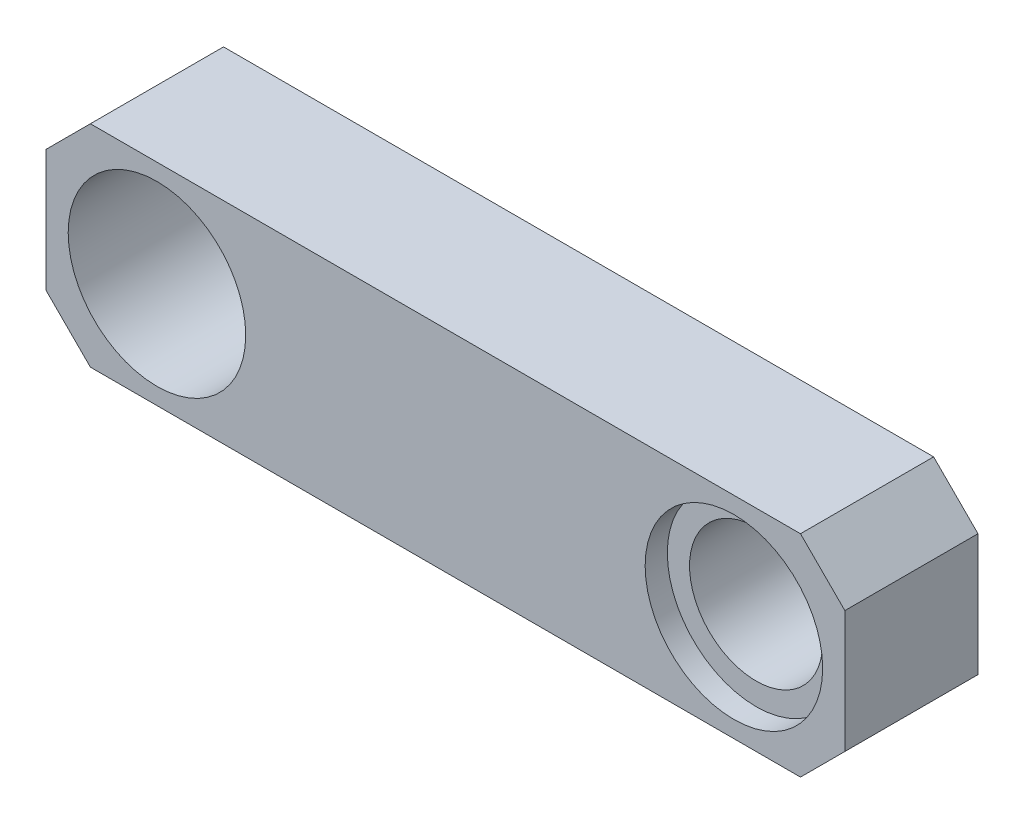
ISO-10303-21;
HEADER;
FILE_DESCRIPTION(('STEP AP214'),'2;1');
FILE_NAME('part.step','',(''),(''),'','','');
FILE_SCHEMA(('AUTOMOTIVE_DESIGN { 1 0 10303 214 1 1 1 1 }'));
ENDSEC;
DATA;
#1=APPLICATION_CONTEXT('core data for automotive mechanical design processes');
#2=APPLICATION_PROTOCOL_DEFINITION('international standard','automotive_design',2000,#1);
#3=PRODUCT_CONTEXT('',#1,'mechanical');
#4=PRODUCT('Part','Part','',(#3));
#5=PRODUCT_RELATED_PRODUCT_CATEGORY('part','',(#4));
#6=PRODUCT_DEFINITION_FORMATION('','',#4);
#7=PRODUCT_DEFINITION_CONTEXT('part definition',#1,'design');
#8=PRODUCT_DEFINITION('design','',#6,#7);
#9=PRODUCT_DEFINITION_SHAPE('','',#8);
#10=(LENGTH_UNIT() NAMED_UNIT(*) SI_UNIT(.MILLI.,.METRE.));
#11=(NAMED_UNIT(*) PLANE_ANGLE_UNIT() SI_UNIT($,.RADIAN.));
#12=(NAMED_UNIT(*) SI_UNIT($,.STERADIAN.) SOLID_ANGLE_UNIT());
#13=UNCERTAINTY_MEASURE_WITH_UNIT(LENGTH_MEASURE(1.E-05),#10,'distance_accuracy_value','');
#14=(GEOMETRIC_REPRESENTATION_CONTEXT(3) GLOBAL_UNCERTAINTY_ASSIGNED_CONTEXT((#13)) GLOBAL_UNIT_ASSIGNED_CONTEXT((#10,
#11,#12)) REPRESENTATION_CONTEXT('',''));
#15=CARTESIAN_POINT('',(0.,0.,0.));
#16=DIRECTION('',(0.,0.,1.));
#17=DIRECTION('',(1.,0.,0.));
#18=AXIS2_PLACEMENT_3D('',#15,#16,#17);
#19=CARTESIAN_POINT('',(0.,0.,3.));
#20=DIRECTION('',(0.,0.,-1.));
#21=DIRECTION('',(-1.,0.,0.));
#22=AXIS2_PLACEMENT_3D('',#19,#20,#21);
#23=PLANE('',#22);
#24=CARTESIAN_POINT('',(13.,0.,3.));
#25=DIRECTION('',(0.,0.,-1.));
#26=DIRECTION('',(-1.,0.,0.));
#27=AXIS2_PLACEMENT_3D('',#24,#25,#26);
#28=CIRCLE('',#27,4.);
#29=CARTESIAN_POINT('',(8.99999999999998,0.,3.));
#30=VERTEX_POINT('',#29);
#31=EDGE_CURVE('E163',#30,#30,#28,.F.);
#32=ORIENTED_EDGE('',*,*,#31,.F.);
#33=EDGE_LOOP('',(#32));
#34=FACE_BOUND('',#33,.T.);
#35=DIRECTION('',(0.,-1.,0.));
#36=VECTOR('',#35,1.);
#37=CARTESIAN_POINT('',(-18.,-4.75,3.));
#38=LINE('',#37,#36);
#39=CARTESIAN_POINT('',(-18.,2.74999999999999,3.));
#40=VERTEX_POINT('',#39);
#41=CARTESIAN_POINT('',(-18.,-2.74999999999999,3.));
#42=VERTEX_POINT('',#41);
#43=EDGE_CURVE('E258',#40,#42,#38,.T.);
#44=ORIENTED_EDGE('',*,*,#43,.T.);
#45=DIRECTION('',(-0.707106781186546,0.707106781186549,0.));
#46=VECTOR('',#45,1.);
#47=CARTESIAN_POINT('',(-16.,-4.75,3.));
#48=LINE('',#47,#46);
#49=CARTESIAN_POINT('',(-16.,-4.75,3.));
#50=VERTEX_POINT('',#49);
#51=EDGE_CURVE('E229',#42,#50,#48,.F.);
#52=ORIENTED_EDGE('',*,*,#51,.T.);
#53=DIRECTION('',(1.,0.,0.));
#54=VECTOR('',#53,1.);
#55=CARTESIAN_POINT('',(-18.,-4.75,3.));
#56=LINE('',#55,#54);
#57=CARTESIAN_POINT('',(16.,-4.75,3.));
#58=VERTEX_POINT('',#57);
#59=EDGE_CURVE('E137',#50,#58,#56,.T.);
#60=ORIENTED_EDGE('',*,*,#59,.T.);
#61=DIRECTION('',(-0.707106781186548,-0.707106781186548,0.));
#62=VECTOR('',#61,1.);
#63=CARTESIAN_POINT('',(18.,-2.74999999999999,3.));
#64=LINE('',#63,#62);
#65=CARTESIAN_POINT('',(18.,-2.74999999999999,3.));
#66=VERTEX_POINT('',#65);
#67=EDGE_CURVE('E222',#58,#66,#64,.F.);
#68=ORIENTED_EDGE('',*,*,#67,.T.);
#69=DIRECTION('',(0.,1.,0.));
#70=VECTOR('',#69,1.);
#71=CARTESIAN_POINT('',(18.,-4.75,3.));
#72=LINE('',#71,#70);
#73=CARTESIAN_POINT('',(18.,2.74999999999999,3.));
#74=VERTEX_POINT('',#73);
#75=EDGE_CURVE('E145',#66,#74,#72,.T.);
#76=ORIENTED_EDGE('',*,*,#75,.T.);
#77=DIRECTION('',(0.707106781186545,-0.70710678118655,0.));
#78=VECTOR('',#77,1.);
#79=CARTESIAN_POINT('',(16.,4.75,3.));
#80=LINE('',#79,#78);
#81=CARTESIAN_POINT('',(16.,4.75,3.));
#82=VERTEX_POINT('',#81);
#83=EDGE_CURVE('E68',#74,#82,#80,.F.);
#84=ORIENTED_EDGE('',*,*,#83,.T.);
#85=DIRECTION('',(-1.,0.,0.));
#86=VECTOR('',#85,1.);
#87=CARTESIAN_POINT('',(-18.,4.74999999999999,3.));
#88=LINE('',#87,#86);
#89=CARTESIAN_POINT('',(-16.,4.74999999999999,3.));
#90=VERTEX_POINT('',#89);
#91=EDGE_CURVE('E149',#82,#90,#88,.T.);
#92=ORIENTED_EDGE('',*,*,#91,.T.);
#93=DIRECTION('',(0.707106781186549,0.707106781186546,0.));
#94=VECTOR('',#93,1.);
#95=CARTESIAN_POINT('',(-18.,2.75,3.));
#96=LINE('',#95,#94);
#97=EDGE_CURVE('E225',#90,#40,#96,.F.);
#98=ORIENTED_EDGE('',*,*,#97,.T.);
#99=EDGE_LOOP('',(#44,#52,#60,#68,#76,#84,#92,#98));
#100=FACE_BOUND('',#99,.T.);
#101=CARTESIAN_POINT('',(-13.,0.,3.000012));
#102=DIRECTION('',(0.,0.,1.));
#103=DIRECTION('',(1.,0.,0.));
#104=AXIS2_PLACEMENT_3D('',#101,#102,#103);
#105=CIRCLE('',#104,4.);
#106=CARTESIAN_POINT('',(-9.00000000000001,0.,3.000012));
#107=VERTEX_POINT('',#106);
#108=EDGE_CURVE('E157',#107,#107,#105,.T.);
#109=ORIENTED_EDGE('',*,*,#108,.F.);
#110=EDGE_LOOP('',(#109));
#111=FACE_BOUND('',#110,.T.);
#112=ADVANCED_FACE('F50',(#34,#100,#111),#23,.F.);
#113=CARTESIAN_POINT('',(18.,-4.75,3.));
#114=DIRECTION('',(-1.,0.,0.));
#115=DIRECTION('',(0.,-1.,0.));
#116=AXIS2_PLACEMENT_3D('',#113,#114,#115);
#117=PLANE('',#116);
#118=ORIENTED_EDGE('',*,*,#75,.F.);
#119=DIRECTION('',(0.,0.,-1.));
#120=VECTOR('',#119,1.);
#121=CARTESIAN_POINT('',(18.,-2.74999999999999,3.));
#122=LINE('',#121,#120);
#123=CARTESIAN_POINT('',(18.,-2.74999999999999,-3.));
#124=VERTEX_POINT('',#123);
#125=EDGE_CURVE('E233',#66,#124,#122,.T.);
#126=ORIENTED_EDGE('',*,*,#125,.T.);
#127=DIRECTION('',(0.,1.,0.));
#128=VECTOR('',#127,1.);
#129=CARTESIAN_POINT('',(18.,-4.75,-3.));
#130=LINE('',#129,#128);
#131=CARTESIAN_POINT('',(18.,2.74999999999999,-3.));
#132=VERTEX_POINT('',#131);
#133=EDGE_CURVE('E241',#124,#132,#130,.T.);
#134=ORIENTED_EDGE('',*,*,#133,.T.);
#135=DIRECTION('',(0.,0.,1.));
#136=VECTOR('',#135,1.);
#137=CARTESIAN_POINT('',(18.,2.74999999999999,3.));
#138=LINE('',#137,#136);
#139=EDGE_CURVE('E218',#132,#74,#138,.T.);
#140=ORIENTED_EDGE('',*,*,#139,.T.);
#141=EDGE_LOOP('',(#118,#126,#134,#140));
#142=FACE_BOUND('',#141,.T.);
#143=ADVANCED_FACE('F172',(#142),#117,.F.);
#144=CARTESIAN_POINT('',(-18.,4.74999999999999,3.));
#145=DIRECTION('',(0.,-1.,0.));
#146=DIRECTION('',(1.,0.,0.));
#147=AXIS2_PLACEMENT_3D('',#144,#145,#146);
#148=PLANE('',#147);
#149=ORIENTED_EDGE('',*,*,#91,.F.);
#150=DIRECTION('',(0.,0.,-1.));
#151=VECTOR('',#150,1.);
#152=CARTESIAN_POINT('',(16.,4.75,3.));
#153=LINE('',#152,#151);
#154=CARTESIAN_POINT('',(16.,4.75,-3.));
#155=VERTEX_POINT('',#154);
#156=EDGE_CURVE('E11',#82,#155,#153,.T.);
#157=ORIENTED_EDGE('',*,*,#156,.T.);
#158=DIRECTION('',(-1.,0.,0.));
#159=VECTOR('',#158,1.);
#160=CARTESIAN_POINT('',(-18.,4.74999999999999,-3.));
#161=LINE('',#160,#159);
#162=CARTESIAN_POINT('',(-16.,4.74999999999999,-3.));
#163=VERTEX_POINT('',#162);
#164=EDGE_CURVE('E151',#155,#163,#161,.T.);
#165=ORIENTED_EDGE('',*,*,#164,.T.);
#166=DIRECTION('',(0.,0.,1.));
#167=VECTOR('',#166,1.);
#168=CARTESIAN_POINT('',(-16.,4.74999999999999,3.));
#169=LINE('',#168,#167);
#170=EDGE_CURVE('E60',#163,#90,#169,.T.);
#171=ORIENTED_EDGE('',*,*,#170,.T.);
#172=EDGE_LOOP('',(#149,#157,#165,#171));
#173=FACE_BOUND('',#172,.T.);
#174=ADVANCED_FACE('F190',(#173),#148,.F.);
#175=CARTESIAN_POINT('',(-18.,-4.75,3.));
#176=DIRECTION('',(1.,0.,0.));
#177=DIRECTION('',(0.,0.,-1.));
#178=AXIS2_PLACEMENT_3D('',#175,#176,#177);
#179=PLANE('',#178);
#180=DIRECTION('',(0.,-1.,0.));
#181=VECTOR('',#180,1.);
#182=CARTESIAN_POINT('',(-18.,-4.75,-3.));
#183=LINE('',#182,#181);
#184=CARTESIAN_POINT('',(-18.,2.74999999999999,-3.));
#185=VERTEX_POINT('',#184);
#186=CARTESIAN_POINT('',(-18.,-2.74999999999999,-3.));
#187=VERTEX_POINT('',#186);
#188=EDGE_CURVE('E144',#185,#187,#183,.T.);
#189=ORIENTED_EDGE('',*,*,#188,.T.);
#190=DIRECTION('',(0.,0.,1.));
#191=VECTOR('',#190,1.);
#192=CARTESIAN_POINT('',(-18.,-2.74999999999999,3.));
#193=LINE('',#192,#191);
#194=EDGE_CURVE('E117',#187,#42,#193,.T.);
#195=ORIENTED_EDGE('',*,*,#194,.T.);
#196=ORIENTED_EDGE('',*,*,#43,.F.);
#197=DIRECTION('',(0.,0.,-1.));
#198=VECTOR('',#197,1.);
#199=CARTESIAN_POINT('',(-18.,2.75,3.));
#200=LINE('',#199,#198);
#201=EDGE_CURVE('E127',#40,#185,#200,.T.);
#202=ORIENTED_EDGE('',*,*,#201,.T.);
#203=EDGE_LOOP('',(#189,#195,#196,#202));
#204=FACE_BOUND('',#203,.T.);
#205=ADVANCED_FACE('F183',(#204),#179,.F.);
#206=CARTESIAN_POINT('',(-18.,-4.75,3.));
#207=DIRECTION('',(0.,1.,0.));
#208=DIRECTION('',(0.,0.,1.));
#209=AXIS2_PLACEMENT_3D('',#206,#207,#208);
#210=PLANE('',#209);
#211=ORIENTED_EDGE('',*,*,#59,.F.);
#212=DIRECTION('',(0.,0.,-1.));
#213=VECTOR('',#212,1.);
#214=CARTESIAN_POINT('',(-16.,-4.75,3.));
#215=LINE('',#214,#213);
#216=CARTESIAN_POINT('',(-16.,-4.75,-3.));
#217=VERTEX_POINT('',#216);
#218=EDGE_CURVE('E118',#50,#217,#215,.T.);
#219=ORIENTED_EDGE('',*,*,#218,.T.);
#220=DIRECTION('',(1.,0.,0.));
#221=VECTOR('',#220,1.);
#222=CARTESIAN_POINT('',(-18.,-4.75,-3.));
#223=LINE('',#222,#221);
#224=CARTESIAN_POINT('',(16.,-4.75,-3.));
#225=VERTEX_POINT('',#224);
#226=EDGE_CURVE('E135',#217,#225,#223,.T.);
#227=ORIENTED_EDGE('',*,*,#226,.T.);
#228=DIRECTION('',(0.,0.,1.));
#229=VECTOR('',#228,1.);
#230=CARTESIAN_POINT('',(16.,-4.75,3.));
#231=LINE('',#230,#229);
#232=EDGE_CURVE('E136',#225,#58,#231,.T.);
#233=ORIENTED_EDGE('',*,*,#232,.T.);
#234=EDGE_LOOP('',(#211,#219,#227,#233));
#235=FACE_BOUND('',#234,.T.);
#236=ADVANCED_FACE('F131',(#235),#210,.F.);
#237=CARTESIAN_POINT('',(0.,0.,-3.));
#238=DIRECTION('',(0.,0.,-1.));
#239=DIRECTION('',(-1.,0.,0.));
#240=AXIS2_PLACEMENT_3D('',#237,#238,#239);
#241=PLANE('',#240);
#242=CARTESIAN_POINT('',(13.,0.,-3.));
#243=DIRECTION('',(0.,0.,1.));
#244=DIRECTION('',(1.,0.,0.));
#245=AXIS2_PLACEMENT_3D('',#242,#243,#244);
#246=CIRCLE('',#245,3.);
#247=CARTESIAN_POINT('',(16.,0.,-3.));
#248=VERTEX_POINT('',#247);
#249=EDGE_CURVE('E277',#248,#248,#246,.T.);
#250=ORIENTED_EDGE('',*,*,#249,.T.);
#251=EDGE_LOOP('',(#250));
#252=FACE_BOUND('',#251,.T.);
#253=CARTESIAN_POINT('',(-13.,0.,-3.));
#254=DIRECTION('',(0.,0.,1.));
#255=DIRECTION('',(1.,0.,0.));
#256=AXIS2_PLACEMENT_3D('',#253,#254,#255);
#257=CIRCLE('',#256,4.);
#258=CARTESIAN_POINT('',(-9.00000000000001,0.,-3.));
#259=VERTEX_POINT('',#258);
#260=EDGE_CURVE('E249',#259,#259,#257,.T.);
#261=ORIENTED_EDGE('',*,*,#260,.T.);
#262=EDGE_LOOP('',(#261));
#263=FACE_BOUND('',#262,.T.);
#264=ORIENTED_EDGE('',*,*,#226,.F.);
#265=DIRECTION('',(0.707106781186546,-0.707106781186549,0.));
#266=VECTOR('',#265,1.);
#267=CARTESIAN_POINT('',(-10.3750000000001,-10.375,-3.));
#268=LINE('',#267,#266);
#269=EDGE_CURVE('E113',#217,#187,#268,.F.);
#270=ORIENTED_EDGE('',*,*,#269,.T.);
#271=ORIENTED_EDGE('',*,*,#188,.F.);
#272=DIRECTION('',(-0.707106781186549,-0.707106781186546,0.));
#273=VECTOR('',#272,1.);
#274=CARTESIAN_POINT('',(-10.375,10.375,-3.));
#275=LINE('',#274,#273);
#276=EDGE_CURVE('E140',#185,#163,#275,.F.);
#277=ORIENTED_EDGE('',*,*,#276,.T.);
#278=ORIENTED_EDGE('',*,*,#164,.F.);
#279=DIRECTION('',(-0.707106781186545,0.70710678118655,0.));
#280=VECTOR('',#279,1.);
#281=CARTESIAN_POINT('',(10.3750000000001,10.375,-3.));
#282=LINE('',#281,#280);
#283=EDGE_CURVE('E242',#155,#132,#282,.F.);
#284=ORIENTED_EDGE('',*,*,#283,.T.);
#285=ORIENTED_EDGE('',*,*,#133,.F.);
#286=DIRECTION('',(0.707106781186548,0.707106781186548,0.));
#287=VECTOR('',#286,1.);
#288=CARTESIAN_POINT('',(10.375,-10.375,-3.));
#289=LINE('',#288,#287);
#290=EDGE_CURVE('E130',#124,#225,#289,.F.);
#291=ORIENTED_EDGE('',*,*,#290,.T.);
#292=EDGE_LOOP('',(#264,#270,#271,#277,#278,#284,#285,#291));
#293=FACE_BOUND('',#292,.T.);
#294=ADVANCED_FACE('F143',(#252,#263,#293),#241,.T.);
#295=CARTESIAN_POINT('',(-13.,0.,-3.));
#296=DIRECTION('',(0.,0.,1.));
#297=DIRECTION('',(1.,0.,0.));
#298=AXIS2_PLACEMENT_3D('',#295,#296,#297);
#299=CYLINDRICAL_SURFACE('',#298,4.);
#300=ORIENTED_EDGE('',*,*,#260,.F.);
#301=EDGE_LOOP('',(#300));
#302=FACE_BOUND('',#301,.T.);
#303=ORIENTED_EDGE('',*,*,#108,.T.);
#304=EDGE_LOOP('',(#303));
#305=FACE_BOUND('',#304,.T.);
#306=ADVANCED_FACE('F179',(#302,#305),#299,.F.);
#307=CARTESIAN_POINT('',(13.,0.,3.12687087838708));
#308=DIRECTION('',(0.,0.,-1.));
#309=DIRECTION('',(-1.,0.,0.));
#310=AXIS2_PLACEMENT_3D('',#307,#308,#309);
#311=CYLINDRICAL_SURFACE('',#310,4.);
#312=CARTESIAN_POINT('',(13.,0.,2.));
#313=DIRECTION('',(0.,0.,1.));
#314=DIRECTION('',(1.,0.,0.));
#315=AXIS2_PLACEMENT_3D('',#312,#313,#314);
#316=CIRCLE('',#315,4.);
#317=CARTESIAN_POINT('',(17.,0.,2.));
#318=VERTEX_POINT('',#317);
#319=EDGE_CURVE('E275',#318,#318,#316,.T.);
#320=ORIENTED_EDGE('',*,*,#319,.F.);
#321=EDGE_LOOP('',(#320));
#322=FACE_BOUND('',#321,.T.);
#323=ORIENTED_EDGE('',*,*,#31,.T.);
#324=EDGE_LOOP('',(#323));
#325=FACE_BOUND('',#324,.T.);
#326=ADVANCED_FACE('F294',(#322,#325),#311,.F.);
#327=CARTESIAN_POINT('',(13.,0.,2.));
#328=DIRECTION('',(0.,0.,1.));
#329=DIRECTION('',(1.,0.,0.));
#330=AXIS2_PLACEMENT_3D('',#327,#328,#329);
#331=PLANE('',#330);
#332=CARTESIAN_POINT('',(13.,0.,2.));
#333=DIRECTION('',(0.,0.,1.));
#334=DIRECTION('',(1.,0.,0.));
#335=AXIS2_PLACEMENT_3D('',#332,#333,#334);
#336=CIRCLE('',#335,3.);
#337=CARTESIAN_POINT('',(16.,0.,2.));
#338=VERTEX_POINT('',#337);
#339=EDGE_CURVE('E280',#338,#338,#336,.T.);
#340=ORIENTED_EDGE('',*,*,#339,.F.);
#341=EDGE_LOOP('',(#340));
#342=FACE_BOUND('',#341,.T.);
#343=ORIENTED_EDGE('',*,*,#319,.T.);
#344=EDGE_LOOP('',(#343));
#345=FACE_BOUND('',#344,.T.);
#346=ADVANCED_FACE('F290',(#342,#345),#331,.T.);
#347=CARTESIAN_POINT('',(13.,0.,-3.));
#348=DIRECTION('',(0.,0.,1.));
#349=DIRECTION('',(1.,0.,0.));
#350=AXIS2_PLACEMENT_3D('',#347,#348,#349);
#351=CYLINDRICAL_SURFACE('',#350,3.);
#352=ORIENTED_EDGE('',*,*,#249,.F.);
#353=EDGE_LOOP('',(#352));
#354=FACE_BOUND('',#353,.T.);
#355=ORIENTED_EDGE('',*,*,#339,.T.);
#356=EDGE_LOOP('',(#355));
#357=FACE_BOUND('',#356,.T.);
#358=ADVANCED_FACE('F205',(#354,#357),#351,.F.);
#359=CARTESIAN_POINT('',(-16.,-4.75,3.));
#360=DIRECTION('',(0.707106781186549,0.707106781186546,0.));
#361=DIRECTION('',(0.,0.,-1.));
#362=AXIS2_PLACEMENT_3D('',#359,#360,#361);
#363=PLANE('',#362);
#364=ORIENTED_EDGE('',*,*,#51,.F.);
#365=ORIENTED_EDGE('',*,*,#194,.F.);
#366=ORIENTED_EDGE('',*,*,#269,.F.);
#367=ORIENTED_EDGE('',*,*,#218,.F.);
#368=EDGE_LOOP('',(#364,#365,#366,#367));
#369=FACE_BOUND('',#368,.T.);
#370=ADVANCED_FACE('F120',(#369),#363,.F.);
#371=CARTESIAN_POINT('',(18.,-2.74999999999999,3.));
#372=DIRECTION('',(-0.707106781186548,0.707106781186548,0.));
#373=DIRECTION('',(0.,0.,-1.));
#374=AXIS2_PLACEMENT_3D('',#371,#372,#373);
#375=PLANE('',#374);
#376=ORIENTED_EDGE('',*,*,#67,.F.);
#377=ORIENTED_EDGE('',*,*,#232,.F.);
#378=ORIENTED_EDGE('',*,*,#290,.F.);
#379=ORIENTED_EDGE('',*,*,#125,.F.);
#380=EDGE_LOOP('',(#376,#377,#378,#379));
#381=FACE_BOUND('',#380,.T.);
#382=ADVANCED_FACE('F203',(#381),#375,.F.);
#383=CARTESIAN_POINT('',(16.,4.75,3.));
#384=DIRECTION('',(-0.70710678118655,-0.707106781186545,0.));
#385=DIRECTION('',(0.,0.,-1.));
#386=AXIS2_PLACEMENT_3D('',#383,#384,#385);
#387=PLANE('',#386);
#388=ORIENTED_EDGE('',*,*,#83,.F.);
#389=ORIENTED_EDGE('',*,*,#139,.F.);
#390=ORIENTED_EDGE('',*,*,#283,.F.);
#391=ORIENTED_EDGE('',*,*,#156,.F.);
#392=EDGE_LOOP('',(#388,#389,#390,#391));
#393=FACE_BOUND('',#392,.T.);
#394=ADVANCED_FACE('F210',(#393),#387,.F.);
#395=CARTESIAN_POINT('',(-18.,2.75,3.));
#396=DIRECTION('',(0.707106781186546,-0.707106781186549,0.));
#397=DIRECTION('',(0.,0.,-1.));
#398=AXIS2_PLACEMENT_3D('',#395,#396,#397);
#399=PLANE('',#398);
#400=ORIENTED_EDGE('',*,*,#97,.F.);
#401=ORIENTED_EDGE('',*,*,#170,.F.);
#402=ORIENTED_EDGE('',*,*,#276,.F.);
#403=ORIENTED_EDGE('',*,*,#201,.F.);
#404=EDGE_LOOP('',(#400,#401,#402,#403));
#405=FACE_BOUND('',#404,.T.);
#406=ADVANCED_FACE('F49',(#405),#399,.F.);
#407=CLOSED_SHELL('',(#112,#143,#174,#205,#236,#294,#306,#326,#346,#358,#370,#382,#394,#406));
#408=MANIFOLD_SOLID_BREP('B2',#407);
#409=ADVANCED_BREP_SHAPE_REPRESENTATION('',(#18,#408),#14);
#410=SHAPE_DEFINITION_REPRESENTATION(#9,#409);
ENDSEC;
END-ISO-10303-21;
